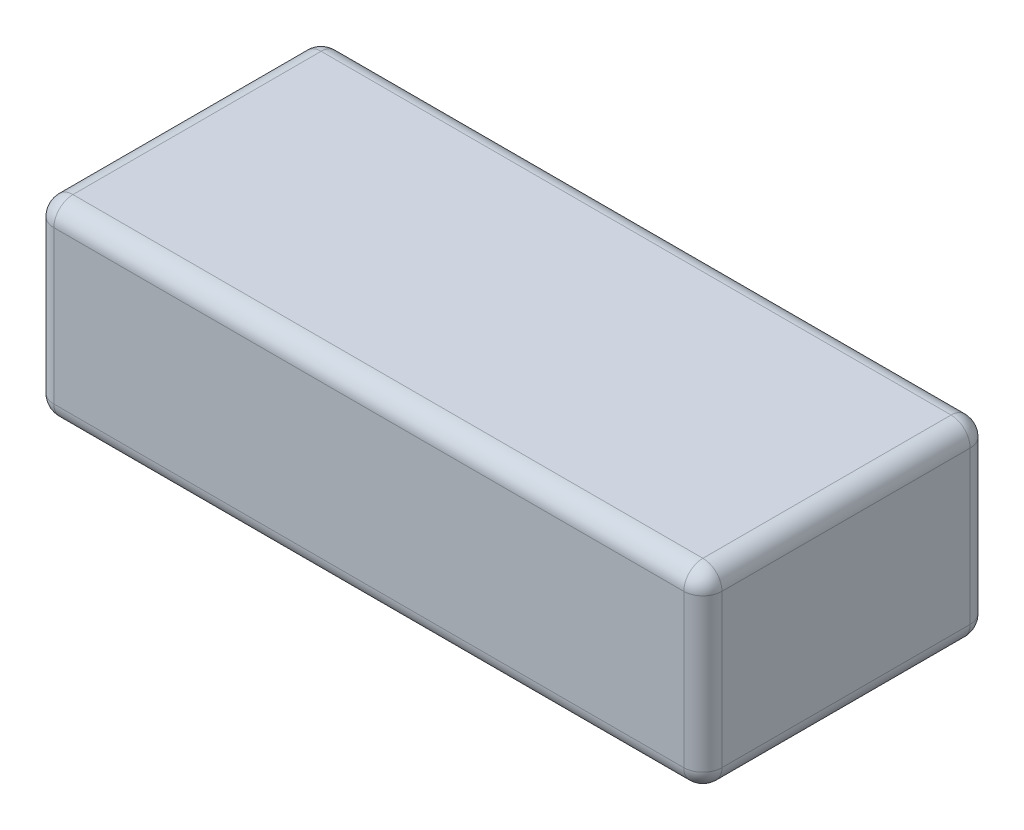
ISO-10303-21;
HEADER;
FILE_DESCRIPTION(('STEP AP214'),'2;1');
FILE_NAME('part.step','',(''),(''),'','','');
FILE_SCHEMA(('AUTOMOTIVE_DESIGN { 1 0 10303 214 1 1 1 1 }'));
ENDSEC;
DATA;
#1=APPLICATION_CONTEXT('core data for automotive mechanical design processes');
#2=APPLICATION_PROTOCOL_DEFINITION('international standard','automotive_design',2000,#1);
#3=PRODUCT_CONTEXT('',#1,'mechanical');
#4=PRODUCT('Part','Part','',(#3));
#5=PRODUCT_RELATED_PRODUCT_CATEGORY('part','',(#4));
#6=PRODUCT_DEFINITION_FORMATION('','',#4);
#7=PRODUCT_DEFINITION_CONTEXT('part definition',#1,'design');
#8=PRODUCT_DEFINITION('design','',#6,#7);
#9=PRODUCT_DEFINITION_SHAPE('','',#8);
#10=(LENGTH_UNIT() NAMED_UNIT(*) SI_UNIT(.MILLI.,.METRE.));
#11=(NAMED_UNIT(*) PLANE_ANGLE_UNIT() SI_UNIT($,.RADIAN.));
#12=(NAMED_UNIT(*) SI_UNIT($,.STERADIAN.) SOLID_ANGLE_UNIT());
#13=UNCERTAINTY_MEASURE_WITH_UNIT(LENGTH_MEASURE(1.E-05),#10,'distance_accuracy_value','');
#14=(GEOMETRIC_REPRESENTATION_CONTEXT(3) GLOBAL_UNCERTAINTY_ASSIGNED_CONTEXT((#13)) GLOBAL_UNIT_ASSIGNED_CONTEXT((#10,
#11,#12)) REPRESENTATION_CONTEXT('',''));
#15=CARTESIAN_POINT('',(0.,0.,0.));
#16=DIRECTION('',(0.,0.,1.));
#17=DIRECTION('',(1.,0.,0.));
#18=AXIS2_PLACEMENT_3D('',#15,#16,#17);
#19=CARTESIAN_POINT('',(35.,20.,15.));
#20=DIRECTION('',(-1.,0.,0.));
#21=DIRECTION('',(0.,0.,1.));
#22=AXIS2_PLACEMENT_3D('',#19,#20,#21);
#23=PLANE('',#22);
#24=DIRECTION('',(0.,-1.,0.));
#25=VECTOR('',#24,1.);
#26=CARTESIAN_POINT('',(35.,20.,13.));
#27=LINE('',#26,#25);
#28=CARTESIAN_POINT('',(35.,18.,13.));
#29=VERTEX_POINT('',#28);
#30=CARTESIAN_POINT('',(35.,2.,13.));
#31=VERTEX_POINT('',#30);
#32=EDGE_CURVE('E187',#29,#31,#27,.T.);
#33=ORIENTED_EDGE('',*,*,#32,.T.);
#34=DIRECTION('',(0.,0.,-1.));
#35=VECTOR('',#34,1.);
#36=CARTESIAN_POINT('',(35.,2.,-15.));
#37=LINE('',#36,#35);
#38=CARTESIAN_POINT('',(35.,2.,-13.));
#39=VERTEX_POINT('',#38);
#40=EDGE_CURVE('E194',#31,#39,#37,.T.);
#41=ORIENTED_EDGE('',*,*,#40,.T.);
#42=DIRECTION('',(0.,-1.,0.));
#43=VECTOR('',#42,1.);
#44=CARTESIAN_POINT('',(35.,20.,-13.));
#45=LINE('',#44,#43);
#46=CARTESIAN_POINT('',(35.,18.,-13.));
#47=VERTEX_POINT('',#46);
#48=EDGE_CURVE('E190',#39,#47,#45,.F.);
#49=ORIENTED_EDGE('',*,*,#48,.T.);
#50=DIRECTION('',(0.,0.,-1.));
#51=VECTOR('',#50,1.);
#52=CARTESIAN_POINT('',(35.,18.,15.));
#53=LINE('',#52,#51);
#54=EDGE_CURVE('E184',#47,#29,#53,.F.);
#55=ORIENTED_EDGE('',*,*,#54,.T.);
#56=EDGE_LOOP('',(#33,#41,#49,#55));
#57=FACE_BOUND('',#56,.T.);
#58=ADVANCED_FACE('F45',(#57),#23,.F.);
#59=CARTESIAN_POINT('',(-35.,20.,-15.));
#60=DIRECTION('',(0.,0.,1.));
#61=DIRECTION('',(1.,0.,0.));
#62=AXIS2_PLACEMENT_3D('',#59,#60,#61);
#63=PLANE('',#62);
#64=DIRECTION('',(0.,-1.,0.));
#65=VECTOR('',#64,1.);
#66=CARTESIAN_POINT('',(33.,20.,-15.));
#67=LINE('',#66,#65);
#68=CARTESIAN_POINT('',(33.,18.,-15.));
#69=VERTEX_POINT('',#68);
#70=CARTESIAN_POINT('',(33.,2.,-15.));
#71=VERTEX_POINT('',#70);
#72=EDGE_CURVE('E146',#69,#71,#67,.T.);
#73=ORIENTED_EDGE('',*,*,#72,.T.);
#74=DIRECTION('',(-1.,0.,0.));
#75=VECTOR('',#74,1.);
#76=CARTESIAN_POINT('',(-35.,2.,-15.));
#77=LINE('',#76,#75);
#78=CARTESIAN_POINT('',(-33.,2.,-15.));
#79=VERTEX_POINT('',#78);
#80=EDGE_CURVE('E141',#71,#79,#77,.T.);
#81=ORIENTED_EDGE('',*,*,#80,.T.);
#82=DIRECTION('',(0.,-1.,0.));
#83=VECTOR('',#82,1.);
#84=CARTESIAN_POINT('',(-33.,20.,-15.));
#85=LINE('',#84,#83);
#86=CARTESIAN_POINT('',(-33.,18.,-15.));
#87=VERTEX_POINT('',#86);
#88=EDGE_CURVE('E133',#79,#87,#85,.F.);
#89=ORIENTED_EDGE('',*,*,#88,.T.);
#90=DIRECTION('',(-1.,0.,0.));
#91=VECTOR('',#90,1.);
#92=CARTESIAN_POINT('',(-35.,18.,-15.));
#93=LINE('',#92,#91);
#94=EDGE_CURVE('E138',#87,#69,#93,.F.);
#95=ORIENTED_EDGE('',*,*,#94,.T.);
#96=EDGE_LOOP('',(#73,#81,#89,#95));
#97=FACE_BOUND('',#96,.T.);
#98=ADVANCED_FACE('F136',(#97),#63,.F.);
#99=CARTESIAN_POINT('',(-35.,20.,15.));
#100=DIRECTION('',(1.,0.,0.));
#101=DIRECTION('',(0.,0.,-1.));
#102=AXIS2_PLACEMENT_3D('',#99,#100,#101);
#103=PLANE('',#102);
#104=DIRECTION('',(0.,-1.,0.));
#105=VECTOR('',#104,1.);
#106=CARTESIAN_POINT('',(-35.,20.,-13.));
#107=LINE('',#106,#105);
#108=CARTESIAN_POINT('',(-35.,18.,-13.));
#109=VERTEX_POINT('',#108);
#110=CARTESIAN_POINT('',(-35.,2.,-13.));
#111=VERTEX_POINT('',#110);
#112=EDGE_CURVE('E154',#109,#111,#107,.T.);
#113=ORIENTED_EDGE('',*,*,#112,.T.);
#114=DIRECTION('',(0.,0.,1.));
#115=VECTOR('',#114,1.);
#116=CARTESIAN_POINT('',(-35.,2.,15.));
#117=LINE('',#116,#115);
#118=CARTESIAN_POINT('',(-35.,2.,13.));
#119=VERTEX_POINT('',#118);
#120=EDGE_CURVE('E218',#111,#119,#117,.T.);
#121=ORIENTED_EDGE('',*,*,#120,.T.);
#122=DIRECTION('',(0.,-1.,0.));
#123=VECTOR('',#122,1.);
#124=CARTESIAN_POINT('',(-35.,20.,13.));
#125=LINE('',#124,#123);
#126=CARTESIAN_POINT('',(-35.,18.,13.));
#127=VERTEX_POINT('',#126);
#128=EDGE_CURVE('E213',#119,#127,#125,.F.);
#129=ORIENTED_EDGE('',*,*,#128,.T.);
#130=DIRECTION('',(0.,0.,1.));
#131=VECTOR('',#130,1.);
#132=CARTESIAN_POINT('',(-35.,18.,15.));
#133=LINE('',#132,#131);
#134=EDGE_CURVE('E210',#127,#109,#133,.F.);
#135=ORIENTED_EDGE('',*,*,#134,.T.);
#136=EDGE_LOOP('',(#113,#121,#129,#135));
#137=FACE_BOUND('',#136,.T.);
#138=ADVANCED_FACE('F356',(#137),#103,.F.);
#139=CARTESIAN_POINT('',(-35.,20.,15.));
#140=DIRECTION('',(0.,0.,-1.));
#141=DIRECTION('',(-1.,0.,0.));
#142=AXIS2_PLACEMENT_3D('',#139,#140,#141);
#143=PLANE('',#142);
#144=DIRECTION('',(0.,-1.,0.));
#145=VECTOR('',#144,1.);
#146=CARTESIAN_POINT('',(-33.,20.,15.));
#147=LINE('',#146,#145);
#148=CARTESIAN_POINT('',(-33.,18.,15.));
#149=VERTEX_POINT('',#148);
#150=CARTESIAN_POINT('',(-33.,2.,15.));
#151=VERTEX_POINT('',#150);
#152=EDGE_CURVE('E200',#149,#151,#147,.T.);
#153=ORIENTED_EDGE('',*,*,#152,.T.);
#154=DIRECTION('',(1.,0.,0.));
#155=VECTOR('',#154,1.);
#156=CARTESIAN_POINT('',(35.,2.,15.));
#157=LINE('',#156,#155);
#158=CARTESIAN_POINT('',(33.,2.,15.));
#159=VERTEX_POINT('',#158);
#160=EDGE_CURVE('E207',#151,#159,#157,.T.);
#161=ORIENTED_EDGE('',*,*,#160,.T.);
#162=DIRECTION('',(0.,-1.,0.));
#163=VECTOR('',#162,1.);
#164=CARTESIAN_POINT('',(33.,20.,15.));
#165=LINE('',#164,#163);
#166=CARTESIAN_POINT('',(33.,18.,15.));
#167=VERTEX_POINT('',#166);
#168=EDGE_CURVE('E203',#159,#167,#165,.F.);
#169=ORIENTED_EDGE('',*,*,#168,.T.);
#170=DIRECTION('',(1.,0.,0.));
#171=VECTOR('',#170,1.);
#172=CARTESIAN_POINT('',(-35.,18.,15.));
#173=LINE('',#172,#171);
#174=EDGE_CURVE('E197',#167,#149,#173,.F.);
#175=ORIENTED_EDGE('',*,*,#174,.T.);
#176=EDGE_LOOP('',(#153,#161,#169,#175));
#177=FACE_BOUND('',#176,.T.);
#178=ADVANCED_FACE('F333',(#177),#143,.F.);
#179=CARTESIAN_POINT('',(0.,20.,0.));
#180=DIRECTION('',(0.,-1.,0.));
#181=DIRECTION('',(0.,0.,-1.));
#182=AXIS2_PLACEMENT_3D('',#179,#180,#181);
#183=PLANE('',#182);
#184=DIRECTION('',(0.,0.,1.));
#185=VECTOR('',#184,1.);
#186=CARTESIAN_POINT('',(-33.,20.,0.));
#187=LINE('',#186,#185);
#188=CARTESIAN_POINT('',(-33.,20.,-13.));
#189=VERTEX_POINT('',#188);
#190=CARTESIAN_POINT('',(-33.,20.,13.));
#191=VERTEX_POINT('',#190);
#192=EDGE_CURVE('E55',#189,#191,#187,.T.);
#193=ORIENTED_EDGE('',*,*,#192,.T.);
#194=DIRECTION('',(1.,0.,0.));
#195=VECTOR('',#194,1.);
#196=CARTESIAN_POINT('',(0.,20.,13.));
#197=LINE('',#196,#195);
#198=CARTESIAN_POINT('',(33.,20.,13.));
#199=VERTEX_POINT('',#198);
#200=EDGE_CURVE('E11',#191,#199,#197,.T.);
#201=ORIENTED_EDGE('',*,*,#200,.T.);
#202=DIRECTION('',(0.,0.,-1.));
#203=VECTOR('',#202,1.);
#204=CARTESIAN_POINT('',(33.,20.,0.));
#205=LINE('',#204,#203);
#206=CARTESIAN_POINT('',(33.,20.,-13.));
#207=VERTEX_POINT('',#206);
#208=EDGE_CURVE('E234',#199,#207,#205,.T.);
#209=ORIENTED_EDGE('',*,*,#208,.T.);
#210=DIRECTION('',(-1.,0.,0.));
#211=VECTOR('',#210,1.);
#212=CARTESIAN_POINT('',(0.,20.,-13.));
#213=LINE('',#212,#211);
#214=EDGE_CURVE('E66',#207,#189,#213,.T.);
#215=ORIENTED_EDGE('',*,*,#214,.T.);
#216=EDGE_LOOP('',(#193,#201,#209,#215));
#217=FACE_BOUND('',#216,.T.);
#218=ADVANCED_FACE('F363',(#217),#183,.F.);
#219=CARTESIAN_POINT('',(0.,0.,0.));
#220=DIRECTION('',(0.,-1.,0.));
#221=DIRECTION('',(0.,0.,-1.));
#222=AXIS2_PLACEMENT_3D('',#219,#220,#221);
#223=PLANE('',#222);
#224=DIRECTION('',(0.,0.,1.));
#225=VECTOR('',#224,1.);
#226=CARTESIAN_POINT('',(-33.,0.,-15.));
#227=LINE('',#226,#225);
#228=CARTESIAN_POINT('',(-33.,0.,13.));
#229=VERTEX_POINT('',#228);
#230=CARTESIAN_POINT('',(-33.,0.,-13.));
#231=VERTEX_POINT('',#230);
#232=EDGE_CURVE('E227',#229,#231,#227,.F.);
#233=ORIENTED_EDGE('',*,*,#232,.T.);
#234=DIRECTION('',(-1.,0.,0.));
#235=VECTOR('',#234,1.);
#236=CARTESIAN_POINT('',(35.,0.,-13.));
#237=LINE('',#236,#235);
#238=CARTESIAN_POINT('',(33.,0.,-13.));
#239=VERTEX_POINT('',#238);
#240=EDGE_CURVE('E230',#231,#239,#237,.F.);
#241=ORIENTED_EDGE('',*,*,#240,.T.);
#242=DIRECTION('',(0.,0.,-1.));
#243=VECTOR('',#242,1.);
#244=CARTESIAN_POINT('',(33.,0.,15.));
#245=LINE('',#244,#243);
#246=CARTESIAN_POINT('',(33.,0.,13.));
#247=VERTEX_POINT('',#246);
#248=EDGE_CURVE('E221',#239,#247,#245,.F.);
#249=ORIENTED_EDGE('',*,*,#248,.T.);
#250=DIRECTION('',(1.,0.,0.));
#251=VECTOR('',#250,1.);
#252=CARTESIAN_POINT('',(-35.,0.,13.));
#253=LINE('',#252,#251);
#254=EDGE_CURVE('E224',#247,#229,#253,.F.);
#255=ORIENTED_EDGE('',*,*,#254,.T.);
#256=EDGE_LOOP('',(#233,#241,#249,#255));
#257=FACE_BOUND('',#256,.T.);
#258=ADVANCED_FACE('F324',(#257),#223,.T.);
#259=CARTESIAN_POINT('',(-33.,20.,13.));
#260=DIRECTION('',(0.,-1.,0.));
#261=DIRECTION('',(0.,0.,-1.));
#262=AXIS2_PLACEMENT_3D('',#259,#260,#261);
#263=CYLINDRICAL_SURFACE('',#262,2.);
#264=CARTESIAN_POINT('',(-33.,18.,13.));
#265=DIRECTION('',(0.,1.,0.));
#266=DIRECTION('',(0.,0.,1.));
#267=AXIS2_PLACEMENT_3D('',#264,#265,#266);
#268=CIRCLE('',#267,2.);
#269=EDGE_CURVE('E49',#127,#149,#268,.T.);
#270=ORIENTED_EDGE('',*,*,#269,.F.);
#271=ORIENTED_EDGE('',*,*,#128,.F.);
#272=CARTESIAN_POINT('',(-33.,2.,13.));
#273=DIRECTION('',(0.,-1.,0.));
#274=DIRECTION('',(0.,0.,-1.));
#275=AXIS2_PLACEMENT_3D('',#272,#273,#274);
#276=CIRCLE('',#275,2.);
#277=EDGE_CURVE('E178',#151,#119,#276,.T.);
#278=ORIENTED_EDGE('',*,*,#277,.F.);
#279=ORIENTED_EDGE('',*,*,#152,.F.);
#280=EDGE_LOOP('',(#270,#271,#278,#279));
#281=FACE_BOUND('',#280,.T.);
#282=ADVANCED_FACE('F47',(#281),#263,.T.);
#283=CARTESIAN_POINT('',(-33.,18.,13.));
#284=DIRECTION('',(0.,0.,1.));
#285=DIRECTION('',(1.,0.,0.));
#286=AXIS2_PLACEMENT_3D('',#283,#284,#285);
#287=SPHERICAL_SURFACE('',#286,2.);
#288=CARTESIAN_POINT('',(-33.,18.,13.));
#289=DIRECTION('',(0.,0.,1.));
#290=DIRECTION('',(1.,0.,0.));
#291=AXIS2_PLACEMENT_3D('',#288,#289,#290);
#292=CIRCLE('',#291,2.);
#293=EDGE_CURVE('E300',#127,#191,#292,.F.);
#294=ORIENTED_EDGE('',*,*,#293,.F.);
#295=ORIENTED_EDGE('',*,*,#269,.T.);
#296=CARTESIAN_POINT('',(-33.,18.,13.));
#297=DIRECTION('',(-1.,0.,0.));
#298=DIRECTION('',(0.,0.,1.));
#299=AXIS2_PLACEMENT_3D('',#296,#297,#298);
#300=CIRCLE('',#299,2.);
#301=EDGE_CURVE('E303',#191,#149,#300,.F.);
#302=ORIENTED_EDGE('',*,*,#301,.F.);
#303=EDGE_LOOP('',(#294,#295,#302));
#304=FACE_BOUND('',#303,.T.);
#305=ADVANCED_FACE('F351',(#304),#287,.T.);
#306=CARTESIAN_POINT('',(-33.,2.,13.));
#307=DIRECTION('',(-1.,0.,0.));
#308=DIRECTION('',(0.,-1.,0.));
#309=AXIS2_PLACEMENT_3D('',#306,#307,#308);
#310=SPHERICAL_SURFACE('',#309,2.);
#311=CARTESIAN_POINT('',(-33.,2.,13.));
#312=DIRECTION('',(-1.,0.,0.));
#313=DIRECTION('',(0.,0.,1.));
#314=AXIS2_PLACEMENT_3D('',#311,#312,#313);
#315=CIRCLE('',#314,2.);
#316=EDGE_CURVE('E292',#151,#229,#315,.F.);
#317=ORIENTED_EDGE('',*,*,#316,.F.);
#318=ORIENTED_EDGE('',*,*,#277,.T.);
#319=CARTESIAN_POINT('',(-33.,2.,13.));
#320=DIRECTION('',(0.,0.,1.));
#321=DIRECTION('',(1.,0.,0.));
#322=AXIS2_PLACEMENT_3D('',#319,#320,#321);
#323=CIRCLE('',#322,2.);
#324=EDGE_CURVE('E296',#229,#119,#323,.F.);
#325=ORIENTED_EDGE('',*,*,#324,.F.);
#326=EDGE_LOOP('',(#317,#318,#325));
#327=FACE_BOUND('',#326,.T.);
#328=ADVANCED_FACE('F312',(#327),#310,.T.);
#329=CARTESIAN_POINT('',(0.,18.,13.));
#330=DIRECTION('',(1.,0.,0.));
#331=DIRECTION('',(0.,0.,-1.));
#332=AXIS2_PLACEMENT_3D('',#329,#330,#331);
#333=CYLINDRICAL_SURFACE('',#332,2.);
#334=ORIENTED_EDGE('',*,*,#301,.T.);
#335=ORIENTED_EDGE('',*,*,#174,.F.);
#336=CARTESIAN_POINT('',(33.,18.,13.));
#337=DIRECTION('',(1.,0.,0.));
#338=DIRECTION('',(0.,0.,-1.));
#339=AXIS2_PLACEMENT_3D('',#336,#337,#338);
#340=CIRCLE('',#339,2.);
#341=EDGE_CURVE('E285',#199,#167,#340,.T.);
#342=ORIENTED_EDGE('',*,*,#341,.F.);
#343=ORIENTED_EDGE('',*,*,#200,.F.);
#344=EDGE_LOOP('',(#334,#335,#342,#343));
#345=FACE_BOUND('',#344,.T.);
#346=ADVANCED_FACE('F345',(#345),#333,.T.);
#347=CARTESIAN_POINT('',(-33.,18.,0.));
#348=DIRECTION('',(0.,0.,1.));
#349=DIRECTION('',(1.,0.,0.));
#350=AXIS2_PLACEMENT_3D('',#347,#348,#349);
#351=CYLINDRICAL_SURFACE('',#350,2.);
#352=ORIENTED_EDGE('',*,*,#293,.T.);
#353=ORIENTED_EDGE('',*,*,#192,.F.);
#354=CARTESIAN_POINT('',(-33.,18.,-13.));
#355=DIRECTION('',(0.,0.,-1.));
#356=DIRECTION('',(0.,1.,0.));
#357=AXIS2_PLACEMENT_3D('',#354,#355,#356);
#358=CIRCLE('',#357,2.);
#359=EDGE_CURVE('E159',#109,#189,#358,.T.);
#360=ORIENTED_EDGE('',*,*,#359,.F.);
#361=ORIENTED_EDGE('',*,*,#134,.F.);
#362=EDGE_LOOP('',(#352,#353,#360,#361));
#363=FACE_BOUND('',#362,.T.);
#364=ADVANCED_FACE('F354',(#363),#351,.T.);
#365=CARTESIAN_POINT('',(-33.,20.,-13.));
#366=DIRECTION('',(0.,-1.,0.));
#367=DIRECTION('',(0.,0.,-1.));
#368=AXIS2_PLACEMENT_3D('',#365,#366,#367);
#369=CYLINDRICAL_SURFACE('',#368,2.);
#370=CARTESIAN_POINT('',(-33.,2.,-13.));
#371=DIRECTION('',(0.,-1.,0.));
#372=DIRECTION('',(0.,0.,-1.));
#373=AXIS2_PLACEMENT_3D('',#370,#371,#372);
#374=CIRCLE('',#373,2.);
#375=EDGE_CURVE('E160',#111,#79,#374,.T.);
#376=ORIENTED_EDGE('',*,*,#375,.F.);
#377=ORIENTED_EDGE('',*,*,#112,.F.);
#378=CARTESIAN_POINT('',(-33.,18.,-13.));
#379=DIRECTION('',(0.,1.,0.));
#380=DIRECTION('',(0.,0.,1.));
#381=AXIS2_PLACEMENT_3D('',#378,#379,#380);
#382=CIRCLE('',#381,2.);
#383=EDGE_CURVE('E150',#87,#109,#382,.T.);
#384=ORIENTED_EDGE('',*,*,#383,.F.);
#385=ORIENTED_EDGE('',*,*,#88,.F.);
#386=EDGE_LOOP('',(#376,#377,#384,#385));
#387=FACE_BOUND('',#386,.T.);
#388=ADVANCED_FACE('F152',(#387),#369,.T.);
#389=CARTESIAN_POINT('',(-33.,2.,15.));
#390=DIRECTION('',(0.,0.,-1.));
#391=DIRECTION('',(-1.,0.,0.));
#392=AXIS2_PLACEMENT_3D('',#389,#390,#391);
#393=CYLINDRICAL_SURFACE('',#392,2.);
#394=ORIENTED_EDGE('',*,*,#324,.T.);
#395=ORIENTED_EDGE('',*,*,#120,.F.);
#396=CARTESIAN_POINT('',(-33.,2.,-13.));
#397=DIRECTION('',(0.,0.,-1.));
#398=DIRECTION('',(-1.,0.,0.));
#399=AXIS2_PLACEMENT_3D('',#396,#397,#398);
#400=CIRCLE('',#399,2.);
#401=EDGE_CURVE('E278',#231,#111,#400,.T.);
#402=ORIENTED_EDGE('',*,*,#401,.F.);
#403=ORIENTED_EDGE('',*,*,#232,.F.);
#404=EDGE_LOOP('',(#394,#395,#402,#403));
#405=FACE_BOUND('',#404,.T.);
#406=ADVANCED_FACE('F320',(#405),#393,.T.);
#407=CARTESIAN_POINT('',(-35.,2.,13.));
#408=DIRECTION('',(-1.,0.,0.));
#409=DIRECTION('',(0.,0.,1.));
#410=AXIS2_PLACEMENT_3D('',#407,#408,#409);
#411=CYLINDRICAL_SURFACE('',#410,2.);
#412=ORIENTED_EDGE('',*,*,#316,.T.);
#413=ORIENTED_EDGE('',*,*,#254,.F.);
#414=CARTESIAN_POINT('',(33.,2.,13.));
#415=DIRECTION('',(1.,0.,0.));
#416=DIRECTION('',(0.,0.,-1.));
#417=AXIS2_PLACEMENT_3D('',#414,#415,#416);
#418=CIRCLE('',#417,2.);
#419=EDGE_CURVE('E274',#159,#247,#418,.T.);
#420=ORIENTED_EDGE('',*,*,#419,.F.);
#421=ORIENTED_EDGE('',*,*,#160,.F.);
#422=EDGE_LOOP('',(#412,#413,#420,#421));
#423=FACE_BOUND('',#422,.T.);
#424=ADVANCED_FACE('F330',(#423),#411,.T.);
#425=CARTESIAN_POINT('',(33.,20.,13.));
#426=DIRECTION('',(0.,-1.,0.));
#427=DIRECTION('',(0.,0.,-1.));
#428=AXIS2_PLACEMENT_3D('',#425,#426,#427);
#429=CYLINDRICAL_SURFACE('',#428,2.);
#430=CARTESIAN_POINT('',(33.,18.,13.));
#431=DIRECTION('',(0.,1.,0.));
#432=DIRECTION('',(0.,0.,1.));
#433=AXIS2_PLACEMENT_3D('',#430,#431,#432);
#434=CIRCLE('',#433,2.);
#435=EDGE_CURVE('E288',#167,#29,#434,.T.);
#436=ORIENTED_EDGE('',*,*,#435,.F.);
#437=ORIENTED_EDGE('',*,*,#168,.F.);
#438=CARTESIAN_POINT('',(33.,2.,13.));
#439=DIRECTION('',(0.,-1.,0.));
#440=DIRECTION('',(0.,0.,-1.));
#441=AXIS2_PLACEMENT_3D('',#438,#439,#440);
#442=CIRCLE('',#441,2.);
#443=EDGE_CURVE('E270',#31,#159,#442,.T.);
#444=ORIENTED_EDGE('',*,*,#443,.F.);
#445=ORIENTED_EDGE('',*,*,#32,.F.);
#446=EDGE_LOOP('',(#436,#437,#444,#445));
#447=FACE_BOUND('',#446,.T.);
#448=ADVANCED_FACE('F337',(#447),#429,.T.);
#449=CARTESIAN_POINT('',(33.,18.,13.));
#450=DIRECTION('',(0.,0.,1.));
#451=DIRECTION('',(1.,0.,0.));
#452=AXIS2_PLACEMENT_3D('',#449,#450,#451);
#453=SPHERICAL_SURFACE('',#452,2.);
#454=ORIENTED_EDGE('',*,*,#341,.T.);
#455=ORIENTED_EDGE('',*,*,#435,.T.);
#456=CARTESIAN_POINT('',(33.,18.,13.));
#457=DIRECTION('',(0.,0.,1.));
#458=DIRECTION('',(1.,0.,0.));
#459=AXIS2_PLACEMENT_3D('',#456,#457,#458);
#460=CIRCLE('',#459,2.);
#461=EDGE_CURVE('E167',#199,#29,#460,.F.);
#462=ORIENTED_EDGE('',*,*,#461,.F.);
#463=EDGE_LOOP('',(#454,#455,#462));
#464=FACE_BOUND('',#463,.T.);
#465=ADVANCED_FACE('F408',(#464),#453,.T.);
#466=CARTESIAN_POINT('',(-33.,18.,-13.));
#467=DIRECTION('',(-1.,0.,0.));
#468=DIRECTION('',(0.,0.,1.));
#469=AXIS2_PLACEMENT_3D('',#466,#467,#468);
#470=SPHERICAL_SURFACE('',#469,2.);
#471=ORIENTED_EDGE('',*,*,#383,.T.);
#472=ORIENTED_EDGE('',*,*,#359,.T.);
#473=CARTESIAN_POINT('',(-33.,18.,-13.));
#474=DIRECTION('',(-1.,0.,0.));
#475=DIRECTION('',(0.,0.,1.));
#476=AXIS2_PLACEMENT_3D('',#473,#474,#475);
#477=CIRCLE('',#476,2.);
#478=EDGE_CURVE('E163',#87,#189,#477,.F.);
#479=ORIENTED_EDGE('',*,*,#478,.F.);
#480=EDGE_LOOP('',(#471,#472,#479));
#481=FACE_BOUND('',#480,.T.);
#482=ADVANCED_FACE('F164',(#481),#470,.T.);
#483=CARTESIAN_POINT('',(-33.,2.,-13.));
#484=DIRECTION('',(-1.,0.,0.));
#485=DIRECTION('',(0.,0.,1.));
#486=AXIS2_PLACEMENT_3D('',#483,#484,#485);
#487=SPHERICAL_SURFACE('',#486,2.);
#488=ORIENTED_EDGE('',*,*,#401,.T.);
#489=ORIENTED_EDGE('',*,*,#375,.T.);
#490=CARTESIAN_POINT('',(-33.,2.,-13.));
#491=DIRECTION('',(-1.,0.,0.));
#492=DIRECTION('',(0.,0.,1.));
#493=AXIS2_PLACEMENT_3D('',#490,#491,#492);
#494=CIRCLE('',#493,2.);
#495=EDGE_CURVE('E168',#231,#79,#494,.F.);
#496=ORIENTED_EDGE('',*,*,#495,.F.);
#497=EDGE_LOOP('',(#488,#489,#496));
#498=FACE_BOUND('',#497,.T.);
#499=ADVANCED_FACE('F401',(#498),#487,.T.);
#500=CARTESIAN_POINT('',(33.,2.,13.));
#501=DIRECTION('',(0.,0.,1.));
#502=DIRECTION('',(0.,-1.,0.));
#503=AXIS2_PLACEMENT_3D('',#500,#501,#502);
#504=SPHERICAL_SURFACE('',#503,2.);
#505=ORIENTED_EDGE('',*,*,#443,.T.);
#506=ORIENTED_EDGE('',*,*,#419,.T.);
#507=CARTESIAN_POINT('',(33.,2.,13.));
#508=DIRECTION('',(0.,0.,1.));
#509=DIRECTION('',(1.,0.,0.));
#510=AXIS2_PLACEMENT_3D('',#507,#508,#509);
#511=CIRCLE('',#510,2.);
#512=EDGE_CURVE('E260',#31,#247,#511,.F.);
#513=ORIENTED_EDGE('',*,*,#512,.F.);
#514=EDGE_LOOP('',(#505,#506,#513));
#515=FACE_BOUND('',#514,.T.);
#516=ADVANCED_FACE('F397',(#515),#504,.T.);
#517=CARTESIAN_POINT('',(33.,18.,0.));
#518=DIRECTION('',(0.,0.,-1.));
#519=DIRECTION('',(-1.,0.,0.));
#520=AXIS2_PLACEMENT_3D('',#517,#518,#519);
#521=CYLINDRICAL_SURFACE('',#520,2.);
#522=ORIENTED_EDGE('',*,*,#461,.T.);
#523=ORIENTED_EDGE('',*,*,#54,.F.);
#524=CARTESIAN_POINT('',(33.,18.,-13.));
#525=DIRECTION('',(0.,0.,-1.));
#526=DIRECTION('',(-1.,0.,0.));
#527=AXIS2_PLACEMENT_3D('',#524,#525,#526);
#528=CIRCLE('',#527,2.);
#529=EDGE_CURVE('E256',#207,#47,#528,.T.);
#530=ORIENTED_EDGE('',*,*,#529,.F.);
#531=ORIENTED_EDGE('',*,*,#208,.F.);
#532=EDGE_LOOP('',(#522,#523,#530,#531));
#533=FACE_BOUND('',#532,.T.);
#534=ADVANCED_FACE('F394',(#533),#521,.T.);
#535=CARTESIAN_POINT('',(0.,18.,-13.));
#536=DIRECTION('',(-1.,0.,0.));
#537=DIRECTION('',(0.,0.,1.));
#538=AXIS2_PLACEMENT_3D('',#535,#536,#537);
#539=CYLINDRICAL_SURFACE('',#538,2.);
#540=ORIENTED_EDGE('',*,*,#478,.T.);
#541=ORIENTED_EDGE('',*,*,#214,.F.);
#542=CARTESIAN_POINT('',(33.,18.,-13.));
#543=DIRECTION('',(1.,0.,0.));
#544=DIRECTION('',(0.,0.,-1.));
#545=AXIS2_PLACEMENT_3D('',#542,#543,#544);
#546=CIRCLE('',#545,2.);
#547=EDGE_CURVE('E172',#69,#207,#546,.T.);
#548=ORIENTED_EDGE('',*,*,#547,.F.);
#549=ORIENTED_EDGE('',*,*,#94,.F.);
#550=EDGE_LOOP('',(#540,#541,#548,#549));
#551=FACE_BOUND('',#550,.T.);
#552=ADVANCED_FACE('F170',(#551),#539,.T.);
#553=CARTESIAN_POINT('',(-35.,2.,-13.));
#554=DIRECTION('',(1.,0.,0.));
#555=DIRECTION('',(0.,0.,-1.));
#556=AXIS2_PLACEMENT_3D('',#553,#554,#555);
#557=CYLINDRICAL_SURFACE('',#556,2.);
#558=ORIENTED_EDGE('',*,*,#495,.T.);
#559=ORIENTED_EDGE('',*,*,#80,.F.);
#560=CARTESIAN_POINT('',(33.,2.,-13.));
#561=DIRECTION('',(1.,0.,0.));
#562=DIRECTION('',(0.,0.,-1.));
#563=AXIS2_PLACEMENT_3D('',#560,#561,#562);
#564=CIRCLE('',#563,2.);
#565=EDGE_CURVE('E250',#239,#71,#564,.T.);
#566=ORIENTED_EDGE('',*,*,#565,.F.);
#567=ORIENTED_EDGE('',*,*,#240,.F.);
#568=EDGE_LOOP('',(#558,#559,#566,#567));
#569=FACE_BOUND('',#568,.T.);
#570=ADVANCED_FACE('F387',(#569),#557,.T.);
#571=CARTESIAN_POINT('',(33.,2.,15.));
#572=DIRECTION('',(0.,0.,1.));
#573=DIRECTION('',(1.,0.,0.));
#574=AXIS2_PLACEMENT_3D('',#571,#572,#573);
#575=CYLINDRICAL_SURFACE('',#574,2.);
#576=ORIENTED_EDGE('',*,*,#512,.T.);
#577=ORIENTED_EDGE('',*,*,#248,.F.);
#578=CARTESIAN_POINT('',(33.,2.,-13.));
#579=DIRECTION('',(0.,0.,-1.));
#580=DIRECTION('',(-1.,0.,0.));
#581=AXIS2_PLACEMENT_3D('',#578,#579,#580);
#582=CIRCLE('',#581,2.);
#583=EDGE_CURVE('E247',#39,#239,#582,.T.);
#584=ORIENTED_EDGE('',*,*,#583,.F.);
#585=ORIENTED_EDGE('',*,*,#40,.F.);
#586=EDGE_LOOP('',(#576,#577,#584,#585));
#587=FACE_BOUND('',#586,.T.);
#588=ADVANCED_FACE('F383',(#587),#575,.T.);
#589=CARTESIAN_POINT('',(33.,18.,-13.));
#590=DIRECTION('',(0.,1.,0.));
#591=DIRECTION('',(0.,0.,1.));
#592=AXIS2_PLACEMENT_3D('',#589,#590,#591);
#593=SPHERICAL_SURFACE('',#592,2.);
#594=ORIENTED_EDGE('',*,*,#547,.T.);
#595=ORIENTED_EDGE('',*,*,#529,.T.);
#596=CARTESIAN_POINT('',(33.,18.,-13.));
#597=DIRECTION('',(0.,1.,0.));
#598=DIRECTION('',(0.,0.,1.));
#599=AXIS2_PLACEMENT_3D('',#596,#597,#598);
#600=CIRCLE('',#599,2.);
#601=EDGE_CURVE('E244',#69,#47,#600,.F.);
#602=ORIENTED_EDGE('',*,*,#601,.F.);
#603=EDGE_LOOP('',(#594,#595,#602));
#604=FACE_BOUND('',#603,.T.);
#605=ADVANCED_FACE('F379',(#604),#593,.T.);
#606=CARTESIAN_POINT('',(33.,2.,-13.));
#607=DIRECTION('',(0.,-1.,0.));
#608=DIRECTION('',(0.,0.,-1.));
#609=AXIS2_PLACEMENT_3D('',#606,#607,#608);
#610=SPHERICAL_SURFACE('',#609,2.);
#611=ORIENTED_EDGE('',*,*,#583,.T.);
#612=ORIENTED_EDGE('',*,*,#565,.T.);
#613=CARTESIAN_POINT('',(33.,2.,-13.));
#614=DIRECTION('',(0.,-1.,0.));
#615=DIRECTION('',(0.,0.,-1.));
#616=AXIS2_PLACEMENT_3D('',#613,#614,#615);
#617=CIRCLE('',#616,2.);
#618=EDGE_CURVE('E241',#39,#71,#617,.F.);
#619=ORIENTED_EDGE('',*,*,#618,.F.);
#620=EDGE_LOOP('',(#611,#612,#619));
#621=FACE_BOUND('',#620,.T.);
#622=ADVANCED_FACE('F375',(#621),#610,.T.);
#623=CARTESIAN_POINT('',(33.,20.,-13.));
#624=DIRECTION('',(0.,-1.,0.));
#625=DIRECTION('',(0.,0.,-1.));
#626=AXIS2_PLACEMENT_3D('',#623,#624,#625);
#627=CYLINDRICAL_SURFACE('',#626,2.);
#628=ORIENTED_EDGE('',*,*,#601,.T.);
#629=ORIENTED_EDGE('',*,*,#48,.F.);
#630=ORIENTED_EDGE('',*,*,#618,.T.);
#631=ORIENTED_EDGE('',*,*,#72,.F.);
#632=EDGE_LOOP('',(#628,#629,#630,#631));
#633=FACE_BOUND('',#632,.T.);
#634=ADVANCED_FACE('F372',(#633),#627,.T.);
#635=CLOSED_SHELL('',(#58,#98,#138,#178,#218,#258,#282,#305,#328,#346,#364,#388,#406,#424,#448,
#465,#482,#499,#516,#534,#552,#570,#588,#605,#622,#634));
#636=MANIFOLD_SOLID_BREP('B2',#635);
#637=ADVANCED_BREP_SHAPE_REPRESENTATION('',(#18,#636),#14);
#638=SHAPE_DEFINITION_REPRESENTATION(#9,#637);
ENDSEC;
END-ISO-10303-21;
